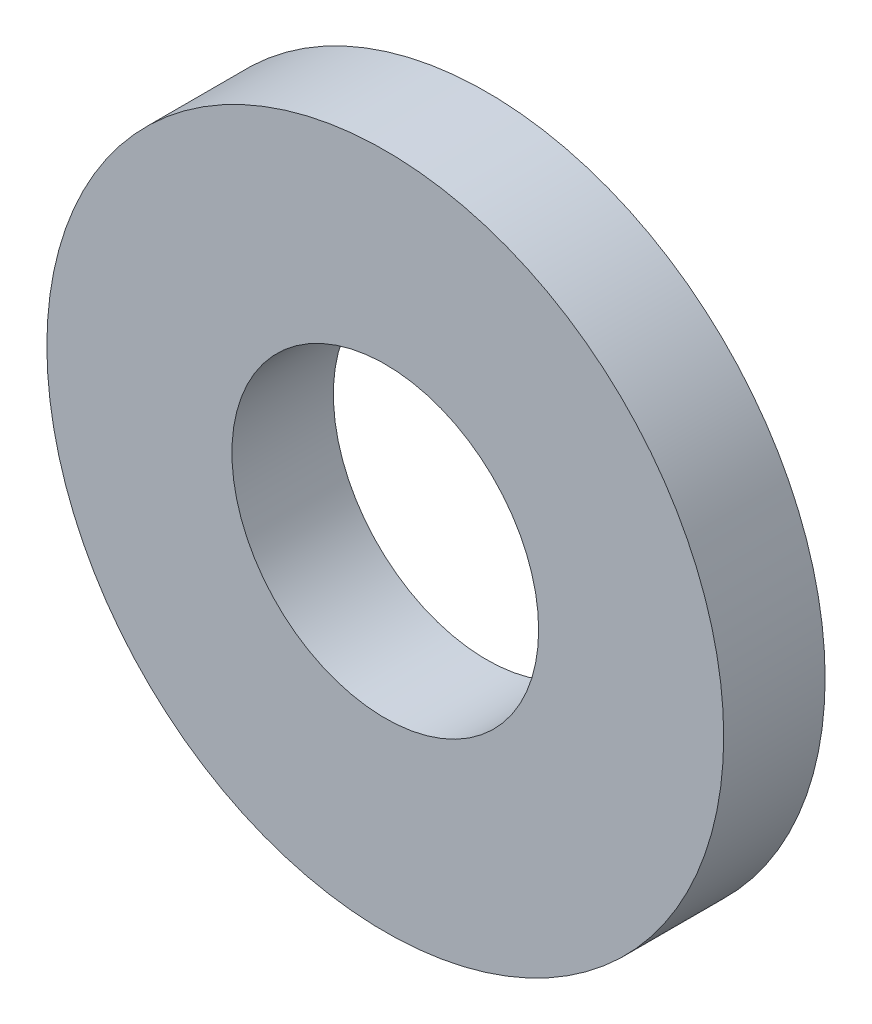
ISO-10303-21;
HEADER;
FILE_DESCRIPTION(('STEP AP214'),'2;1');
FILE_NAME('part.step','',(''),(''),'','','');
FILE_SCHEMA(('AUTOMOTIVE_DESIGN { 1 0 10303 214 1 1 1 1 }'));
ENDSEC;
DATA;
#1=APPLICATION_CONTEXT('core data for automotive mechanical design processes');
#2=APPLICATION_PROTOCOL_DEFINITION('international standard','automotive_design',2000,#1);
#3=PRODUCT_CONTEXT('',#1,'mechanical');
#4=PRODUCT('Part','Part','',(#3));
#5=PRODUCT_RELATED_PRODUCT_CATEGORY('part','',(#4));
#6=PRODUCT_DEFINITION_FORMATION('','',#4);
#7=PRODUCT_DEFINITION_CONTEXT('part definition',#1,'design');
#8=PRODUCT_DEFINITION('design','',#6,#7);
#9=PRODUCT_DEFINITION_SHAPE('','',#8);
#10=(LENGTH_UNIT() NAMED_UNIT(*) SI_UNIT(.MILLI.,.METRE.));
#11=(NAMED_UNIT(*) PLANE_ANGLE_UNIT() SI_UNIT($,.RADIAN.));
#12=(NAMED_UNIT(*) SI_UNIT($,.STERADIAN.) SOLID_ANGLE_UNIT());
#13=UNCERTAINTY_MEASURE_WITH_UNIT(LENGTH_MEASURE(1.E-05),#10,'distance_accuracy_value','');
#14=(GEOMETRIC_REPRESENTATION_CONTEXT(3) GLOBAL_UNCERTAINTY_ASSIGNED_CONTEXT((#13)) GLOBAL_UNIT_ASSIGNED_CONTEXT((#10,
#11,#12)) REPRESENTATION_CONTEXT('',''));
#15=CARTESIAN_POINT('',(0.,0.,0.));
#16=DIRECTION('',(0.,0.,1.));
#17=DIRECTION('',(1.,0.,0.));
#18=AXIS2_PLACEMENT_3D('',#15,#16,#17);
#19=CARTESIAN_POINT('',(0.,0.,1.5748));
#20=DIRECTION('',(0.,0.,1.));
#21=DIRECTION('',(1.,0.,0.));
#22=AXIS2_PLACEMENT_3D('',#19,#20,#21);
#23=PLANE('',#22);
#24=CARTESIAN_POINT('',(0.,0.,1.5748));
#25=DIRECTION('',(0.,0.,1.));
#26=DIRECTION('',(1.,0.,0.));
#27=AXIS2_PLACEMENT_3D('',#24,#25,#26);
#28=CIRCLE('',#27,5.254625);
#29=CARTESIAN_POINT('',(5.254625,0.,1.5748));
#30=VERTEX_POINT('',#29);
#31=EDGE_CURVE('E10',#30,#30,#28,.T.);
#32=ORIENTED_EDGE('',*,*,#31,.T.);
#33=EDGE_LOOP('',(#32));
#34=FACE_BOUND('',#33,.T.);
#35=CARTESIAN_POINT('',(0.,0.,1.5748));
#36=DIRECTION('',(0.,0.,1.));
#37=DIRECTION('',(1.,0.,0.));
#38=AXIS2_PLACEMENT_3D('',#35,#36,#37);
#39=CIRCLE('',#38,2.38125);
#40=CARTESIAN_POINT('',(2.38125,0.,1.5748));
#41=VERTEX_POINT('',#40);
#42=EDGE_CURVE('E42',#41,#41,#39,.T.);
#43=ORIENTED_EDGE('',*,*,#42,.F.);
#44=EDGE_LOOP('',(#43));
#45=FACE_BOUND('',#44,.T.);
#46=ADVANCED_FACE('F31',(#34,#45),#23,.T.);
#47=CARTESIAN_POINT('',(0.,0.,0.));
#48=DIRECTION('',(0.,0.,1.));
#49=DIRECTION('',(1.,0.,0.));
#50=AXIS2_PLACEMENT_3D('',#47,#48,#49);
#51=PLANE('',#50);
#52=CARTESIAN_POINT('',(0.,0.,0.));
#53=DIRECTION('',(0.,0.,1.));
#54=DIRECTION('',(1.,0.,0.));
#55=AXIS2_PLACEMENT_3D('',#52,#53,#54);
#56=CIRCLE('',#55,5.254625);
#57=CARTESIAN_POINT('',(5.254625,0.,0.));
#58=VERTEX_POINT('',#57);
#59=EDGE_CURVE('E35',#58,#58,#56,.T.);
#60=ORIENTED_EDGE('',*,*,#59,.F.);
#61=EDGE_LOOP('',(#60));
#62=FACE_BOUND('',#61,.T.);
#63=CARTESIAN_POINT('',(0.,0.,0.));
#64=DIRECTION('',(0.,0.,1.));
#65=DIRECTION('',(1.,0.,0.));
#66=AXIS2_PLACEMENT_3D('',#63,#64,#65);
#67=CIRCLE('',#66,2.38125);
#68=CARTESIAN_POINT('',(2.38125,0.,0.));
#69=VERTEX_POINT('',#68);
#70=EDGE_CURVE('E44',#69,#69,#67,.T.);
#71=ORIENTED_EDGE('',*,*,#70,.T.);
#72=EDGE_LOOP('',(#71));
#73=FACE_BOUND('',#72,.T.);
#74=ADVANCED_FACE('F54',(#62,#73),#51,.F.);
#75=CARTESIAN_POINT('',(0.,0.,1.5748));
#76=DIRECTION('',(0.,0.,-1.));
#77=DIRECTION('',(-1.,0.,0.));
#78=AXIS2_PLACEMENT_3D('',#75,#76,#77);
#79=CYLINDRICAL_SURFACE('',#78,5.254625);
#80=ORIENTED_EDGE('',*,*,#31,.F.);
#81=EDGE_LOOP('',(#80));
#82=FACE_BOUND('',#81,.T.);
#83=ORIENTED_EDGE('',*,*,#59,.T.);
#84=EDGE_LOOP('',(#83));
#85=FACE_BOUND('',#84,.T.);
#86=ADVANCED_FACE('F33',(#82,#85),#79,.T.);
#87=CARTESIAN_POINT('',(0.,0.,1.5748));
#88=DIRECTION('',(0.,0.,-1.));
#89=DIRECTION('',(-1.,0.,0.));
#90=AXIS2_PLACEMENT_3D('',#87,#88,#89);
#91=CYLINDRICAL_SURFACE('',#90,2.38125);
#92=ORIENTED_EDGE('',*,*,#42,.T.);
#93=EDGE_LOOP('',(#92));
#94=FACE_BOUND('',#93,.T.);
#95=ORIENTED_EDGE('',*,*,#70,.F.);
#96=EDGE_LOOP('',(#95));
#97=FACE_BOUND('',#96,.T.);
#98=ADVANCED_FACE('F50',(#94,#97),#91,.F.);
#99=CLOSED_SHELL('',(#46,#74,#86,#98));
#100=MANIFOLD_SOLID_BREP('B2',#99);
#101=ADVANCED_BREP_SHAPE_REPRESENTATION('',(#18,#100),#14);
#102=SHAPE_DEFINITION_REPRESENTATION(#9,#101);
ENDSEC;
END-ISO-10303-21;
